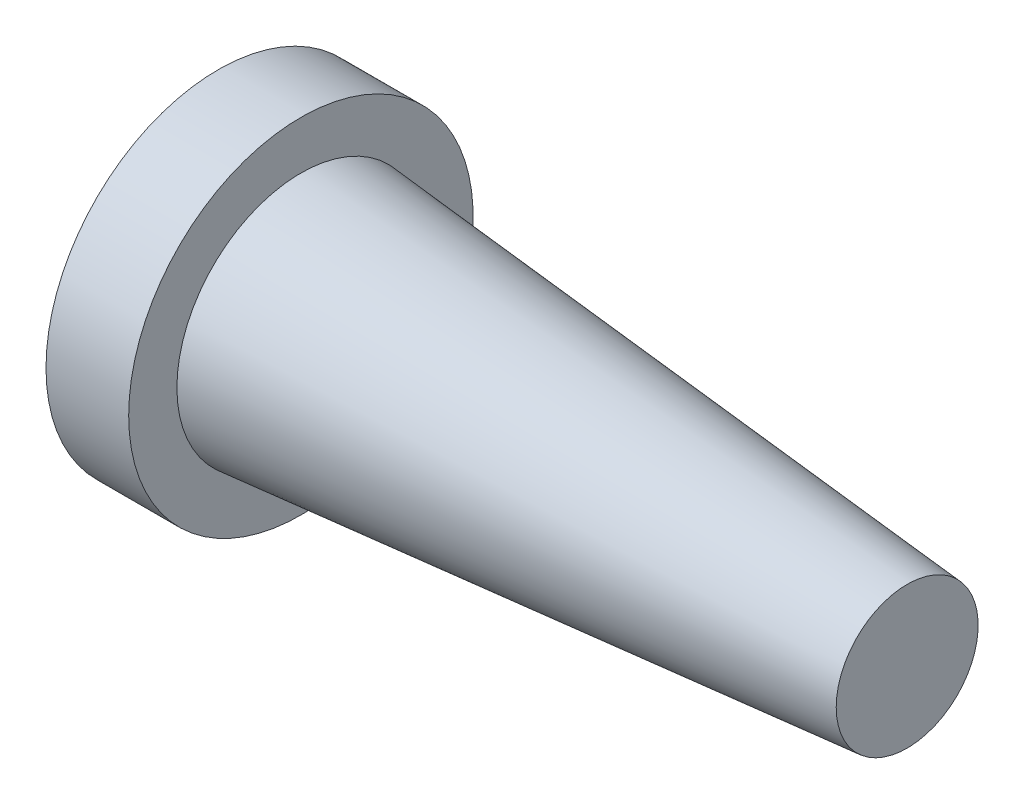
ISO-10303-21;
HEADER;
FILE_DESCRIPTION(('STEP AP214'),'2;1');
FILE_NAME('part.step','',(''),(''),'','','');
FILE_SCHEMA(('AUTOMOTIVE_DESIGN { 1 0 10303 214 1 1 1 1 }'));
ENDSEC;
DATA;
#1=APPLICATION_CONTEXT('core data for automotive mechanical design processes');
#2=APPLICATION_PROTOCOL_DEFINITION('international standard','automotive_design',2000,#1);
#3=PRODUCT_CONTEXT('',#1,'mechanical');
#4=PRODUCT('Part','Part','',(#3));
#5=PRODUCT_RELATED_PRODUCT_CATEGORY('part','',(#4));
#6=PRODUCT_DEFINITION_FORMATION('','',#4);
#7=PRODUCT_DEFINITION_CONTEXT('part definition',#1,'design');
#8=PRODUCT_DEFINITION('design','',#6,#7);
#9=PRODUCT_DEFINITION_SHAPE('','',#8);
#10=(LENGTH_UNIT() NAMED_UNIT(*) SI_UNIT(.MILLI.,.METRE.));
#11=(NAMED_UNIT(*) PLANE_ANGLE_UNIT() SI_UNIT($,.RADIAN.));
#12=(NAMED_UNIT(*) SI_UNIT($,.STERADIAN.) SOLID_ANGLE_UNIT());
#13=UNCERTAINTY_MEASURE_WITH_UNIT(LENGTH_MEASURE(1.E-05),#10,'distance_accuracy_value','');
#14=(GEOMETRIC_REPRESENTATION_CONTEXT(3) GLOBAL_UNCERTAINTY_ASSIGNED_CONTEXT((#13)) GLOBAL_UNIT_ASSIGNED_CONTEXT((#10,
#11,#12)) REPRESENTATION_CONTEXT('',''));
#15=CARTESIAN_POINT('',(0.,0.,0.));
#16=DIRECTION('',(0.,0.,1.));
#17=DIRECTION('',(1.,0.,0.));
#18=AXIS2_PLACEMENT_3D('',#15,#16,#17);
#19=CARTESIAN_POINT('',(-110.009795310745,0.,0.));
#20=DIRECTION('',(-1.,0.,0.));
#21=DIRECTION('',(0.,0.,1.));
#22=AXIS2_PLACEMENT_3D('',#19,#20,#21);
#23=CYLINDRICAL_SURFACE('',#22,25.);
#24=CARTESIAN_POINT('',(-50.,0.,0.));
#25=DIRECTION('',(-1.,0.,0.));
#26=DIRECTION('',(0.,0.,1.));
#27=AXIS2_PLACEMENT_3D('',#24,#25,#26);
#28=CIRCLE('',#27,25.);
#29=CARTESIAN_POINT('',(-50.,0.,25.));
#30=VERTEX_POINT('',#29);
#31=EDGE_CURVE('E68',#30,#30,#28,.T.);
#32=ORIENTED_EDGE('',*,*,#31,.F.);
#33=EDGE_LOOP('',(#32));
#34=FACE_BOUND('',#33,.T.);
#35=CARTESIAN_POINT('',(-38.,0.,0.));
#36=DIRECTION('',(-1.,0.,0.));
#37=DIRECTION('',(0.,0.,1.));
#38=AXIS2_PLACEMENT_3D('',#35,#36,#37);
#39=CIRCLE('',#38,25.);
#40=CARTESIAN_POINT('',(-38.,0.,25.));
#41=VERTEX_POINT('',#40);
#42=EDGE_CURVE('E11',#41,#41,#39,.T.);
#43=ORIENTED_EDGE('',*,*,#42,.T.);
#44=EDGE_LOOP('',(#43));
#45=FACE_BOUND('',#44,.T.);
#46=ADVANCED_FACE('F39',(#34,#45),#23,.T.);
#47=CARTESIAN_POINT('',(-38.,25.,0.));
#48=DIRECTION('',(-1.,0.,0.));
#49=DIRECTION('',(0.,0.,1.));
#50=AXIS2_PLACEMENT_3D('',#47,#48,#49);
#51=PLANE('',#50);
#52=ORIENTED_EDGE('',*,*,#42,.F.);
#53=EDGE_LOOP('',(#52));
#54=FACE_BOUND('',#53,.T.);
#55=CARTESIAN_POINT('',(-38.,0.,0.));
#56=DIRECTION('',(-1.,0.,0.));
#57=DIRECTION('',(0.,0.,1.));
#58=AXIS2_PLACEMENT_3D('',#55,#56,#57);
#59=CIRCLE('',#58,18.);
#60=CARTESIAN_POINT('',(-38.,0.,18.));
#61=VERTEX_POINT('',#60);
#62=EDGE_CURVE('E45',#61,#61,#59,.T.);
#63=ORIENTED_EDGE('',*,*,#62,.T.);
#64=EDGE_LOOP('',(#63));
#65=FACE_BOUND('',#64,.T.);
#66=ADVANCED_FACE('F77',(#54,#65),#51,.F.);
#67=CARTESIAN_POINT('',(50.,0.,0.));
#68=DIRECTION('',(-1.,0.,0.));
#69=DIRECTION('',(0.,0.,1.));
#70=AXIS2_PLACEMENT_3D('',#67,#68,#69);
#71=CONICAL_SURFACE('',#70,10.3009976097193,0.0872664625997095);
#72=ORIENTED_EDGE('',*,*,#62,.F.);
#73=EDGE_LOOP('',(#72));
#74=FACE_BOUND('',#73,.T.);
#75=CARTESIAN_POINT('',(50.,0.,0.));
#76=DIRECTION('',(-1.,0.,0.));
#77=DIRECTION('',(0.,0.,1.));
#78=AXIS2_PLACEMENT_3D('',#75,#76,#77);
#79=CIRCLE('',#78,10.3009976097193);
#80=CARTESIAN_POINT('',(50.,0.,10.3009976097193));
#81=VERTEX_POINT('',#80);
#82=EDGE_CURVE('E72',#81,#81,#79,.T.);
#83=ORIENTED_EDGE('',*,*,#82,.T.);
#84=EDGE_LOOP('',(#83));
#85=FACE_BOUND('',#84,.T.);
#86=ADVANCED_FACE('F79',(#74,#85),#71,.T.);
#87=CARTESIAN_POINT('',(50.,10.3009976097193,0.));
#88=DIRECTION('',(-1.,0.,0.));
#89=DIRECTION('',(0.,0.,1.));
#90=AXIS2_PLACEMENT_3D('',#87,#88,#89);
#91=PLANE('',#90);
#92=ORIENTED_EDGE('',*,*,#82,.F.);
#93=EDGE_LOOP('',(#92));
#94=FACE_BOUND('',#93,.T.);
#95=ADVANCED_FACE('F82',(#94),#91,.F.);
#96=CARTESIAN_POINT('',(-50.,0.,0.));
#97=DIRECTION('',(1.,0.,0.));
#98=DIRECTION('',(0.,0.,-1.));
#99=AXIS2_PLACEMENT_3D('',#96,#97,#98);
#100=PLANE('',#99);
#101=CARTESIAN_POINT('',(-50.,0.,0.));
#102=DIRECTION('',(-1.,0.,0.));
#103=DIRECTION('',(0.,0.,1.));
#104=AXIS2_PLACEMENT_3D('',#101,#102,#103);
#105=CIRCLE('',#104,5.);
#106=CARTESIAN_POINT('',(-50.,0.,5.));
#107=VERTEX_POINT('',#106);
#108=EDGE_CURVE('E58',#107,#107,#105,.T.);
#109=ORIENTED_EDGE('',*,*,#108,.F.);
#110=EDGE_LOOP('',(#109));
#111=FACE_BOUND('',#110,.T.);
#112=ORIENTED_EDGE('',*,*,#31,.T.);
#113=EDGE_LOOP('',(#112));
#114=FACE_BOUND('',#113,.T.);
#115=ADVANCED_FACE('F87',(#111,#114),#100,.F.);
#116=CARTESIAN_POINT('',(-20.,0.,0.));
#117=DIRECTION('',(-1.,0.,0.));
#118=DIRECTION('',(0.,0.,1.));
#119=AXIS2_PLACEMENT_3D('',#116,#117,#118);
#120=CYLINDRICAL_SURFACE('',#119,5.);
#121=CARTESIAN_POINT('',(-20.,0.,0.));
#122=DIRECTION('',(-1.,0.,0.));
#123=DIRECTION('',(0.,0.,1.));
#124=AXIS2_PLACEMENT_3D('',#121,#122,#123);
#125=CIRCLE('',#124,5.);
#126=CARTESIAN_POINT('',(-20.,0.,5.));
#127=VERTEX_POINT('',#126);
#128=EDGE_CURVE('E62',#127,#127,#125,.T.);
#129=ORIENTED_EDGE('',*,*,#128,.F.);
#130=EDGE_LOOP('',(#129));
#131=FACE_BOUND('',#130,.T.);
#132=ORIENTED_EDGE('',*,*,#108,.T.);
#133=EDGE_LOOP('',(#132));
#134=FACE_BOUND('',#133,.T.);
#135=ADVANCED_FACE('F92',(#131,#134),#120,.F.);
#136=CARTESIAN_POINT('',(-20.,0.,0.));
#137=DIRECTION('',(-1.,0.,0.));
#138=DIRECTION('',(0.,0.,1.));
#139=AXIS2_PLACEMENT_3D('',#136,#137,#138);
#140=PLANE('',#139);
#141=CARTESIAN_POINT('',(-20.,0.,0.));
#142=DIRECTION('',(-1.,0.,0.));
#143=DIRECTION('',(0.,0.,1.));
#144=AXIS2_PLACEMENT_3D('',#141,#142,#143);
#145=CIRCLE('',#144,1.99999999999999);
#146=CARTESIAN_POINT('',(-20.,0.,1.99999999999999));
#147=VERTEX_POINT('',#146);
#148=EDGE_CURVE('E59',#147,#147,#145,.T.);
#149=ORIENTED_EDGE('',*,*,#148,.F.);
#150=EDGE_LOOP('',(#149));
#151=FACE_BOUND('',#150,.T.);
#152=ORIENTED_EDGE('',*,*,#128,.T.);
#153=EDGE_LOOP('',(#152));
#154=FACE_BOUND('',#153,.T.);
#155=ADVANCED_FACE('F52',(#151,#154),#140,.T.);
#156=CARTESIAN_POINT('',(-14.,0.,0.));
#157=DIRECTION('',(-1.,0.,0.));
#158=DIRECTION('',(0.,0.,1.));
#159=AXIS2_PLACEMENT_3D('',#156,#157,#158);
#160=CONICAL_SURFACE('',#159,2.,1.02974425867665);
#161=CARTESIAN_POINT('',(-12.7982787619449,0.,0.));
#162=VERTEX_POINT('',#161);
#163=VERTEX_LOOP('',#162);
#164=FACE_BOUND('',#163,.T.);
#165=CARTESIAN_POINT('',(-14.,0.,0.));
#166=DIRECTION('',(-1.,0.,0.));
#167=DIRECTION('',(0.,0.,1.));
#168=AXIS2_PLACEMENT_3D('',#165,#166,#167);
#169=CIRCLE('',#168,2.);
#170=CARTESIAN_POINT('',(-14.,0.,2.));
#171=VERTEX_POINT('',#170);
#172=EDGE_CURVE('E56',#171,#171,#169,.T.);
#173=ORIENTED_EDGE('',*,*,#172,.T.);
#174=EDGE_LOOP('',(#173));
#175=FACE_BOUND('',#174,.T.);
#176=ADVANCED_FACE('F48',(#164,#175),#160,.F.);
#177=CARTESIAN_POINT('',(-20.,0.,0.));
#178=DIRECTION('',(-1.,0.,0.));
#179=DIRECTION('',(0.,0.,1.));
#180=AXIS2_PLACEMENT_3D('',#177,#178,#179);
#181=CYLINDRICAL_SURFACE('',#180,1.99999999999999);
#182=ORIENTED_EDGE('',*,*,#172,.F.);
#183=EDGE_LOOP('',(#182));
#184=FACE_BOUND('',#183,.T.);
#185=ORIENTED_EDGE('',*,*,#148,.T.);
#186=EDGE_LOOP('',(#185));
#187=FACE_BOUND('',#186,.T.);
#188=ADVANCED_FACE('F51',(#184,#187),#181,.F.);
#189=CLOSED_SHELL('',(#46,#66,#86,#95,#115,#135,#155,#176,#188));
#190=MANIFOLD_SOLID_BREP('B2',#189);
#191=ADVANCED_BREP_SHAPE_REPRESENTATION('',(#18,#190),#14);
#192=SHAPE_DEFINITION_REPRESENTATION(#9,#191);
ENDSEC;
END-ISO-10303-21;
